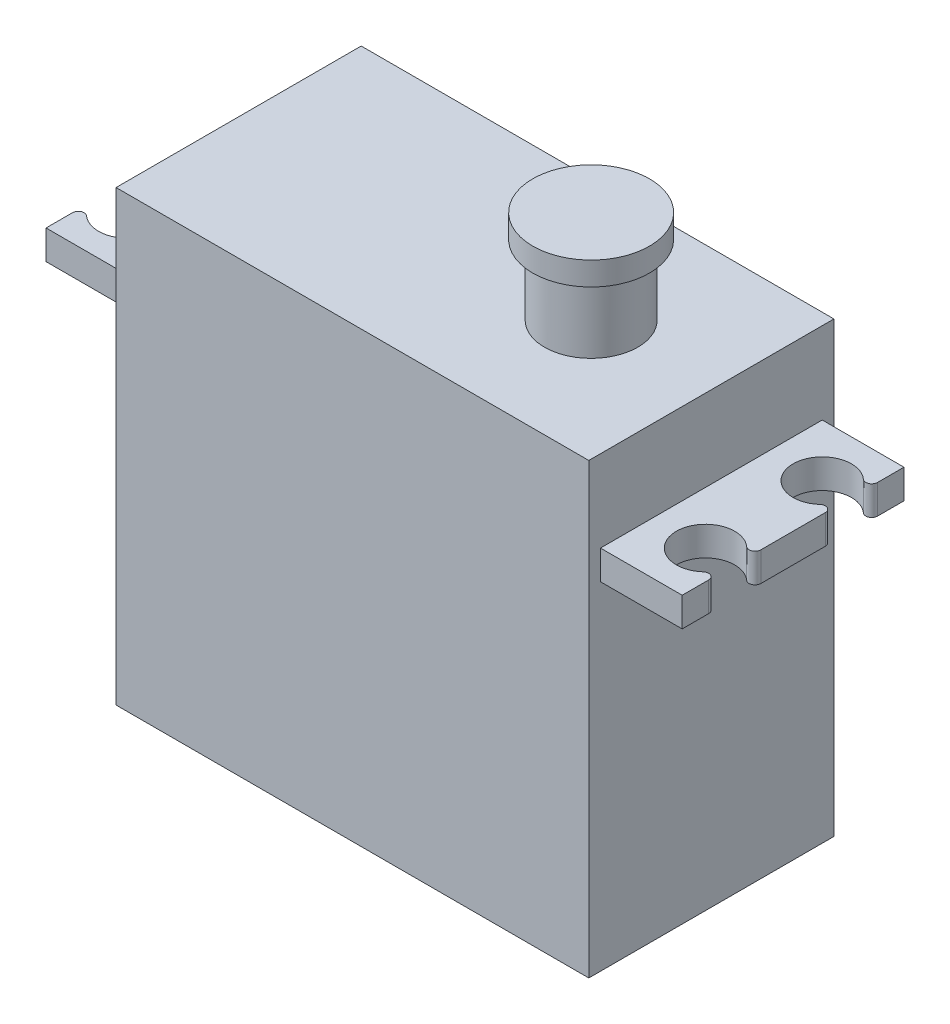
ISO-10303-21;
HEADER;
FILE_DESCRIPTION(('STEP AP214'),'2;1');
FILE_NAME('part.step','',(''),(''),'','','');
FILE_SCHEMA(('AUTOMOTIVE_DESIGN { 1 0 10303 214 1 1 1 1 }'));
ENDSEC;
DATA;
#1=APPLICATION_CONTEXT('core data for automotive mechanical design processes');
#2=APPLICATION_PROTOCOL_DEFINITION('international standard','automotive_design',2000,#1);
#3=PRODUCT_CONTEXT('',#1,'mechanical');
#4=PRODUCT('Part','Part','',(#3));
#5=PRODUCT_RELATED_PRODUCT_CATEGORY('part','',(#4));
#6=PRODUCT_DEFINITION_FORMATION('','',#4);
#7=PRODUCT_DEFINITION_CONTEXT('part definition',#1,'design');
#8=PRODUCT_DEFINITION('design','',#6,#7);
#9=PRODUCT_DEFINITION_SHAPE('','',#8);
#10=(LENGTH_UNIT() NAMED_UNIT(*) SI_UNIT(.MILLI.,.METRE.));
#11=(NAMED_UNIT(*) PLANE_ANGLE_UNIT() SI_UNIT($,.RADIAN.));
#12=(NAMED_UNIT(*) SI_UNIT($,.STERADIAN.) SOLID_ANGLE_UNIT());
#13=UNCERTAINTY_MEASURE_WITH_UNIT(LENGTH_MEASURE(1.E-05),#10,'distance_accuracy_value','');
#14=(GEOMETRIC_REPRESENTATION_CONTEXT(3) GLOBAL_UNCERTAINTY_ASSIGNED_CONTEXT((#13)) GLOBAL_UNIT_ASSIGNED_CONTEXT((#10,
#11,#12)) REPRESENTATION_CONTEXT('',''));
#15=CARTESIAN_POINT('',(0.,0.,0.));
#16=DIRECTION('',(0.,0.,1.));
#17=DIRECTION('',(1.,0.,0.));
#18=AXIS2_PLACEMENT_3D('',#15,#16,#17);
#19=CARTESIAN_POINT('',(9.94999999999999,46.4,0.));
#20=DIRECTION('',(0.,-1.,0.));
#21=DIRECTION('',(0.,0.,-1.));
#22=AXIS2_PLACEMENT_3D('',#19,#20,#21);
#23=CYLINDRICAL_SURFACE('',#22,5.);
#24=CARTESIAN_POINT('',(9.94999999999999,46.4,0.));
#25=DIRECTION('',(0.,1.,0.));
#26=DIRECTION('',(0.,0.,1.));
#27=AXIS2_PLACEMENT_3D('',#24,#25,#26);
#28=CIRCLE('',#27,5.);
#29=CARTESIAN_POINT('',(9.94999999999999,46.4,5.));
#30=VERTEX_POINT('',#29);
#31=EDGE_CURVE('E11',#30,#30,#28,.T.);
#32=ORIENTED_EDGE('',*,*,#31,.F.);
#33=EDGE_LOOP('',(#32));
#34=FACE_BOUND('',#33,.T.);
#35=CARTESIAN_POINT('',(9.94999999999999,44.4,0.));
#36=DIRECTION('',(0.,1.,0.));
#37=DIRECTION('',(0.,0.,1.));
#38=AXIS2_PLACEMENT_3D('',#35,#36,#37);
#39=CIRCLE('',#38,5.);
#40=CARTESIAN_POINT('',(9.94999999999999,44.4,5.));
#41=VERTEX_POINT('',#40);
#42=EDGE_CURVE('E47',#41,#41,#39,.T.);
#43=ORIENTED_EDGE('',*,*,#42,.T.);
#44=EDGE_LOOP('',(#43));
#45=FACE_BOUND('',#44,.T.);
#46=ADVANCED_FACE('F44',(#34,#45),#23,.T.);
#47=CARTESIAN_POINT('',(0.,46.4,0.));
#48=DIRECTION('',(0.,1.,0.));
#49=DIRECTION('',(0.,0.,1.));
#50=AXIS2_PLACEMENT_3D('',#47,#48,#49);
#51=PLANE('',#50);
#52=ORIENTED_EDGE('',*,*,#31,.T.);
#53=EDGE_LOOP('',(#52));
#54=FACE_BOUND('',#53,.T.);
#55=ADVANCED_FACE('F59',(#54),#51,.T.);
#56=CARTESIAN_POINT('',(0.,44.4,0.));
#57=DIRECTION('',(0.,1.,0.));
#58=DIRECTION('',(0.,0.,1.));
#59=AXIS2_PLACEMENT_3D('',#56,#57,#58);
#60=PLANE('',#59);
#61=ORIENTED_EDGE('',*,*,#42,.F.);
#62=EDGE_LOOP('',(#61));
#63=FACE_BOUND('',#62,.T.);
#64=ADVANCED_FACE('F57',(#63),#60,.F.);
#65=CLOSED_SHELL('',(#46,#55,#64));
#66=MANIFOLD_SOLID_BREP('B2',#65);
#67=CARTESIAN_POINT('',(20.25,38.4,10.5));
#68=DIRECTION('',(-1.,0.,0.));
#69=DIRECTION('',(0.,0.,1.));
#70=AXIS2_PLACEMENT_3D('',#67,#68,#69);
#71=PLANE('',#70);
#72=DIRECTION('',(0.,0.,-1.));
#73=VECTOR('',#72,1.);
#74=CARTESIAN_POINT('',(20.25,0.,10.5));
#75=LINE('',#74,#73);
#76=CARTESIAN_POINT('',(20.25,0.,10.5));
#77=VERTEX_POINT('',#76);
#78=CARTESIAN_POINT('',(20.25,0.,-10.5));
#79=VERTEX_POINT('',#78);
#80=EDGE_CURVE('E455',#77,#79,#75,.T.);
#81=ORIENTED_EDGE('',*,*,#80,.T.);
#82=DIRECTION('',(0.,-1.,0.));
#83=VECTOR('',#82,1.);
#84=CARTESIAN_POINT('',(20.25,38.4,-10.5));
#85=LINE('',#84,#83);
#86=CARTESIAN_POINT('',(20.25,38.4,-10.5));
#87=VERTEX_POINT('',#86);
#88=EDGE_CURVE('E482',#87,#79,#85,.T.);
#89=ORIENTED_EDGE('',*,*,#88,.F.);
#90=DIRECTION('',(0.,0.,-1.));
#91=VECTOR('',#90,1.);
#92=CARTESIAN_POINT('',(20.25,38.4,10.5));
#93=LINE('',#92,#91);
#94=CARTESIAN_POINT('',(20.25,38.4,10.5));
#95=VERTEX_POINT('',#94);
#96=EDGE_CURVE('E456',#95,#87,#93,.T.);
#97=ORIENTED_EDGE('',*,*,#96,.F.);
#98=DIRECTION('',(0.,-1.,0.));
#99=VECTOR('',#98,1.);
#100=CARTESIAN_POINT('',(20.25,38.4,10.5));
#101=LINE('',#100,#99);
#102=EDGE_CURVE('E466',#95,#77,#101,.T.);
#103=ORIENTED_EDGE('',*,*,#102,.T.);
#104=EDGE_LOOP('',(#81,#89,#97,#103));
#105=FACE_BOUND('',#104,.T.);
#106=DIRECTION('',(0.,0.,1.));
#107=VECTOR('',#106,1.);
#108=CARTESIAN_POINT('',(20.25,31.4,10.5));
#109=LINE('',#108,#107);
#110=CARTESIAN_POINT('',(20.25,31.4,-9.49999999999999));
#111=VERTEX_POINT('',#110);
#112=CARTESIAN_POINT('',(20.25,31.4,9.50000000000001));
#113=VERTEX_POINT('',#112);
#114=EDGE_CURVE('E446',#111,#113,#109,.T.);
#115=ORIENTED_EDGE('',*,*,#114,.F.);
#116=DIRECTION('',(0.,-1.,0.));
#117=VECTOR('',#116,1.);
#118=CARTESIAN_POINT('',(20.25,38.4,-9.49999999999999));
#119=LINE('',#118,#117);
#120=CARTESIAN_POINT('',(20.25,28.9,-9.49999999999999));
#121=VERTEX_POINT('',#120);
#122=EDGE_CURVE('E276',#111,#121,#119,.T.);
#123=ORIENTED_EDGE('',*,*,#122,.T.);
#124=DIRECTION('',(0.,0.,1.));
#125=VECTOR('',#124,1.);
#126=CARTESIAN_POINT('',(20.25,28.9,10.5));
#127=LINE('',#126,#125);
#128=CARTESIAN_POINT('',(20.25,28.9,9.50000000000001));
#129=VERTEX_POINT('',#128);
#130=EDGE_CURVE('E407',#121,#129,#127,.T.);
#131=ORIENTED_EDGE('',*,*,#130,.T.);
#132=DIRECTION('',(0.,1.,0.));
#133=VECTOR('',#132,1.);
#134=CARTESIAN_POINT('',(20.25,38.4,9.50000000000001));
#135=LINE('',#134,#133);
#136=EDGE_CURVE('E448',#129,#113,#135,.T.);
#137=ORIENTED_EDGE('',*,*,#136,.T.);
#138=EDGE_LOOP('',(#115,#123,#131,#137));
#139=FACE_BOUND('',#138,.T.);
#140=ADVANCED_FACE('F84',(#105,#139),#71,.F.);
#141=CARTESIAN_POINT('',(-20.25,38.4,10.5));
#142=DIRECTION('',(1.,0.,0.));
#143=DIRECTION('',(0.,0.,-1.));
#144=AXIS2_PLACEMENT_3D('',#141,#142,#143);
#145=PLANE('',#144);
#146=DIRECTION('',(0.,0.,1.));
#147=VECTOR('',#146,1.);
#148=CARTESIAN_POINT('',(-20.25,0.,10.5));
#149=LINE('',#148,#147);
#150=CARTESIAN_POINT('',(-20.25,0.,-10.5));
#151=VERTEX_POINT('',#150);
#152=CARTESIAN_POINT('',(-20.25,0.,10.5));
#153=VERTEX_POINT('',#152);
#154=EDGE_CURVE('E471',#151,#153,#149,.T.);
#155=ORIENTED_EDGE('',*,*,#154,.T.);
#156=DIRECTION('',(0.,-1.,0.));
#157=VECTOR('',#156,1.);
#158=CARTESIAN_POINT('',(-20.25,38.4,10.5));
#159=LINE('',#158,#157);
#160=CARTESIAN_POINT('',(-20.25,38.4,10.5));
#161=VERTEX_POINT('',#160);
#162=EDGE_CURVE('E476',#161,#153,#159,.T.);
#163=ORIENTED_EDGE('',*,*,#162,.F.);
#164=DIRECTION('',(0.,0.,1.));
#165=VECTOR('',#164,1.);
#166=CARTESIAN_POINT('',(-20.25,38.4,10.5));
#167=LINE('',#166,#165);
#168=CARTESIAN_POINT('',(-20.25,38.4,-10.5));
#169=VERTEX_POINT('',#168);
#170=EDGE_CURVE('E462',#169,#161,#167,.T.);
#171=ORIENTED_EDGE('',*,*,#170,.F.);
#172=DIRECTION('',(0.,-1.,0.));
#173=VECTOR('',#172,1.);
#174=CARTESIAN_POINT('',(-20.25,38.4,-10.5));
#175=LINE('',#174,#173);
#176=EDGE_CURVE('E479',#169,#151,#175,.T.);
#177=ORIENTED_EDGE('',*,*,#176,.T.);
#178=EDGE_LOOP('',(#155,#163,#171,#177));
#179=FACE_BOUND('',#178,.T.);
#180=DIRECTION('',(0.,0.,-1.));
#181=VECTOR('',#180,1.);
#182=CARTESIAN_POINT('',(-20.25,31.4,10.5));
#183=LINE('',#182,#181);
#184=CARTESIAN_POINT('',(-20.25,31.4,9.5));
#185=VERTEX_POINT('',#184);
#186=CARTESIAN_POINT('',(-20.25,31.4,-9.50000000000001));
#187=VERTEX_POINT('',#186);
#188=EDGE_CURVE('E42',#185,#187,#183,.T.);
#189=ORIENTED_EDGE('',*,*,#188,.F.);
#190=DIRECTION('',(0.,-1.,0.));
#191=VECTOR('',#190,1.);
#192=CARTESIAN_POINT('',(-20.25,38.4,9.5));
#193=LINE('',#192,#191);
#194=CARTESIAN_POINT('',(-20.25,28.9,9.5));
#195=VERTEX_POINT('',#194);
#196=EDGE_CURVE('E491',#185,#195,#193,.T.);
#197=ORIENTED_EDGE('',*,*,#196,.T.);
#198=DIRECTION('',(0.,0.,-1.));
#199=VECTOR('',#198,1.);
#200=CARTESIAN_POINT('',(-20.25,28.9,10.5));
#201=LINE('',#200,#199);
#202=CARTESIAN_POINT('',(-20.25,28.9,-9.50000000000001));
#203=VERTEX_POINT('',#202);
#204=EDGE_CURVE('E488',#195,#203,#201,.T.);
#205=ORIENTED_EDGE('',*,*,#204,.T.);
#206=DIRECTION('',(0.,1.,0.));
#207=VECTOR('',#206,1.);
#208=CARTESIAN_POINT('',(-20.25,38.4,-9.50000000000001));
#209=LINE('',#208,#207);
#210=EDGE_CURVE('E91',#203,#187,#209,.T.);
#211=ORIENTED_EDGE('',*,*,#210,.T.);
#212=EDGE_LOOP('',(#189,#197,#205,#211));
#213=FACE_BOUND('',#212,.T.);
#214=ADVANCED_FACE('F496',(#179,#213),#145,.F.);
#215=CARTESIAN_POINT('',(-20.25,38.4,-10.5));
#216=DIRECTION('',(0.,0.,1.));
#217=DIRECTION('',(1.,0.,0.));
#218=AXIS2_PLACEMENT_3D('',#215,#216,#217);
#219=PLANE('',#218);
#220=DIRECTION('',(-1.,0.,0.));
#221=VECTOR('',#220,1.);
#222=CARTESIAN_POINT('',(-20.25,0.,-10.5));
#223=LINE('',#222,#221);
#224=EDGE_CURVE('E469',#79,#151,#223,.T.);
#225=ORIENTED_EDGE('',*,*,#224,.T.);
#226=ORIENTED_EDGE('',*,*,#176,.F.);
#227=DIRECTION('',(-1.,0.,0.));
#228=VECTOR('',#227,1.);
#229=CARTESIAN_POINT('',(-20.25,38.4,-10.5));
#230=LINE('',#229,#228);
#231=EDGE_CURVE('E459',#87,#169,#230,.T.);
#232=ORIENTED_EDGE('',*,*,#231,.F.);
#233=ORIENTED_EDGE('',*,*,#88,.T.);
#234=EDGE_LOOP('',(#225,#226,#232,#233));
#235=FACE_BOUND('',#234,.T.);
#236=ADVANCED_FACE('F561',(#235),#219,.F.);
#237=CARTESIAN_POINT('',(-20.25,38.4,10.5));
#238=DIRECTION('',(0.,0.,-1.));
#239=DIRECTION('',(-1.,0.,0.));
#240=AXIS2_PLACEMENT_3D('',#237,#238,#239);
#241=PLANE('',#240);
#242=DIRECTION('',(1.,0.,0.));
#243=VECTOR('',#242,1.);
#244=CARTESIAN_POINT('',(-20.25,0.,10.5));
#245=LINE('',#244,#243);
#246=EDGE_CURVE('E460',#153,#77,#245,.T.);
#247=ORIENTED_EDGE('',*,*,#246,.T.);
#248=ORIENTED_EDGE('',*,*,#102,.F.);
#249=DIRECTION('',(1.,0.,0.));
#250=VECTOR('',#249,1.);
#251=CARTESIAN_POINT('',(-20.25,38.4,10.5));
#252=LINE('',#251,#250);
#253=EDGE_CURVE('E464',#161,#95,#252,.T.);
#254=ORIENTED_EDGE('',*,*,#253,.F.);
#255=ORIENTED_EDGE('',*,*,#162,.T.);
#256=EDGE_LOOP('',(#247,#248,#254,#255));
#257=FACE_BOUND('',#256,.T.);
#258=ADVANCED_FACE('F623',(#257),#241,.F.);
#259=CARTESIAN_POINT('',(0.,38.4,0.));
#260=DIRECTION('',(0.,-1.,0.));
#261=DIRECTION('',(0.,0.,-1.));
#262=AXIS2_PLACEMENT_3D('',#259,#260,#261);
#263=PLANE('',#262);
#264=CARTESIAN_POINT('',(9.94999999999999,38.4,0.));
#265=DIRECTION('',(0.,-1.,0.));
#266=DIRECTION('',(0.,0.,-1.));
#267=AXIS2_PLACEMENT_3D('',#264,#265,#266);
#268=CIRCLE('',#267,4.);
#269=CARTESIAN_POINT('',(9.94999999999999,38.4,-4.));
#270=VERTEX_POINT('',#269);
#271=EDGE_CURVE('E485',#270,#270,#268,.F.);
#272=ORIENTED_EDGE('',*,*,#271,.F.);
#273=EDGE_LOOP('',(#272));
#274=FACE_BOUND('',#273,.T.);
#275=ORIENTED_EDGE('',*,*,#96,.T.);
#276=ORIENTED_EDGE('',*,*,#231,.T.);
#277=ORIENTED_EDGE('',*,*,#170,.T.);
#278=ORIENTED_EDGE('',*,*,#253,.T.);
#279=EDGE_LOOP('',(#275,#276,#277,#278));
#280=FACE_BOUND('',#279,.T.);
#281=ADVANCED_FACE('F620',(#274,#280),#263,.F.);
#282=CARTESIAN_POINT('',(0.,0.,0.));
#283=DIRECTION('',(0.,-1.,0.));
#284=DIRECTION('',(0.,0.,-1.));
#285=AXIS2_PLACEMENT_3D('',#282,#283,#284);
#286=PLANE('',#285);
#287=ORIENTED_EDGE('',*,*,#80,.F.);
#288=ORIENTED_EDGE('',*,*,#246,.F.);
#289=ORIENTED_EDGE('',*,*,#154,.F.);
#290=ORIENTED_EDGE('',*,*,#224,.F.);
#291=EDGE_LOOP('',(#287,#288,#289,#290));
#292=FACE_BOUND('',#291,.T.);
#293=ADVANCED_FACE('F618',(#292),#286,.T.);
#294=CARTESIAN_POINT('',(9.94999999999999,44.4,0.));
#295=DIRECTION('',(0.,-1.,0.));
#296=DIRECTION('',(0.,0.,-1.));
#297=AXIS2_PLACEMENT_3D('',#294,#295,#296);
#298=CYLINDRICAL_SURFACE('',#297,4.);
#299=CARTESIAN_POINT('',(9.94999999999999,44.4,0.));
#300=DIRECTION('',(0.,1.,0.));
#301=DIRECTION('',(0.,0.,1.));
#302=AXIS2_PLACEMENT_3D('',#299,#300,#301);
#303=CIRCLE('',#302,4.);
#304=CARTESIAN_POINT('',(9.94999999999999,44.4,4.));
#305=VERTEX_POINT('',#304);
#306=EDGE_CURVE('E452',#305,#305,#303,.T.);
#307=ORIENTED_EDGE('',*,*,#306,.F.);
#308=EDGE_LOOP('',(#307));
#309=FACE_BOUND('',#308,.T.);
#310=ORIENTED_EDGE('',*,*,#271,.T.);
#311=EDGE_LOOP('',(#310));
#312=FACE_BOUND('',#311,.T.);
#313=ADVANCED_FACE('F614',(#309,#312),#298,.T.);
#314=CARTESIAN_POINT('',(9.94999999999999,44.4,0.));
#315=DIRECTION('',(0.,1.,0.));
#316=DIRECTION('',(0.,0.,1.));
#317=AXIS2_PLACEMENT_3D('',#314,#315,#316);
#318=PLANE('',#317);
#319=ORIENTED_EDGE('',*,*,#306,.T.);
#320=EDGE_LOOP('',(#319));
#321=FACE_BOUND('',#320,.T.);
#322=ADVANCED_FACE('F611',(#321),#318,.T.);
#323=CARTESIAN_POINT('',(-27.25,31.4,-7.23606797749977));
#324=DIRECTION('',(-1.,0.,0.));
#325=DIRECTION('',(0.,0.,1.));
#326=AXIS2_PLACEMENT_3D('',#323,#324,#325);
#327=PLANE('',#326);
#328=DIRECTION('',(0.,0.,-1.));
#329=VECTOR('',#328,1.);
#330=CARTESIAN_POINT('',(-27.25,28.9,-7.23606797749977));
#331=LINE('',#330,#329);
#332=CARTESIAN_POINT('',(-27.25,28.9,-7.23606797749977));
#333=VERTEX_POINT('',#332);
#334=CARTESIAN_POINT('',(-27.25,28.9,-9.50000000000001));
#335=VERTEX_POINT('',#334);
#336=EDGE_CURVE('E281',#333,#335,#331,.T.);
#337=ORIENTED_EDGE('',*,*,#336,.F.);
#338=DIRECTION('',(0.,-1.,0.));
#339=VECTOR('',#338,1.);
#340=CARTESIAN_POINT('',(-27.25,31.4,-7.23606797749977));
#341=LINE('',#340,#339);
#342=CARTESIAN_POINT('',(-27.25,31.4,-7.23606797749977));
#343=VERTEX_POINT('',#342);
#344=EDGE_CURVE('E408',#343,#333,#341,.T.);
#345=ORIENTED_EDGE('',*,*,#344,.F.);
#346=DIRECTION('',(0.,0.,-1.));
#347=VECTOR('',#346,1.);
#348=CARTESIAN_POINT('',(-27.25,31.4,-7.23606797749977));
#349=LINE('',#348,#347);
#350=CARTESIAN_POINT('',(-27.25,31.4,-9.50000000000001));
#351=VERTEX_POINT('',#350);
#352=EDGE_CURVE('E290',#343,#351,#349,.T.);
#353=ORIENTED_EDGE('',*,*,#352,.T.);
#354=DIRECTION('',(0.,-1.,0.));
#355=VECTOR('',#354,1.);
#356=CARTESIAN_POINT('',(-27.25,31.4,-9.50000000000001));
#357=LINE('',#356,#355);
#358=EDGE_CURVE('E405',#351,#335,#357,.T.);
#359=ORIENTED_EDGE('',*,*,#358,.T.);
#360=EDGE_LOOP('',(#337,#345,#353,#359));
#361=FACE_BOUND('',#360,.T.);
#362=ADVANCED_FACE('F507',(#361),#327,.T.);
#363=CARTESIAN_POINT('',(-26.75,31.4,-7.23606797749977));
#364=DIRECTION('',(0.,-1.,0.));
#365=DIRECTION('',(0.,0.,-1.));
#366=AXIS2_PLACEMENT_3D('',#363,#364,#365);
#367=CYLINDRICAL_SURFACE('',#366,0.500000000000003);
#368=CARTESIAN_POINT('',(-26.75,28.9,-7.23606797749977));
#369=DIRECTION('',(0.,-1.,0.));
#370=DIRECTION('',(0.,0.,-1.));
#371=AXIS2_PLACEMENT_3D('',#368,#369,#370);
#372=CIRCLE('',#371,0.500000000000003);
#373=CARTESIAN_POINT('',(-26.4166666666667,28.9,-6.8633899812498));
#374=VERTEX_POINT('',#373);
#375=EDGE_CURVE('E401',#374,#333,#372,.T.);
#376=ORIENTED_EDGE('',*,*,#375,.F.);
#377=DIRECTION('',(0.,-1.,0.));
#378=VECTOR('',#377,1.);
#379=CARTESIAN_POINT('',(-26.4166666666667,31.4,-6.8633899812498));
#380=LINE('',#379,#378);
#381=CARTESIAN_POINT('',(-26.4166666666667,31.4,-6.8633899812498));
#382=VERTEX_POINT('',#381);
#383=EDGE_CURVE('E410',#382,#374,#380,.T.);
#384=ORIENTED_EDGE('',*,*,#383,.F.);
#385=CARTESIAN_POINT('',(-26.75,31.4,-7.23606797749977));
#386=DIRECTION('',(0.,-1.,0.));
#387=DIRECTION('',(0.,0.,-1.));
#388=AXIS2_PLACEMENT_3D('',#385,#386,#387);
#389=CIRCLE('',#388,0.500000000000003);
#390=EDGE_CURVE('E347',#382,#343,#389,.T.);
#391=ORIENTED_EDGE('',*,*,#390,.T.);
#392=ORIENTED_EDGE('',*,*,#344,.T.);
#393=EDGE_LOOP('',(#376,#384,#391,#392));
#394=FACE_BOUND('',#393,.T.);
#395=ADVANCED_FACE('F510',(#394),#367,.T.);
#396=CARTESIAN_POINT('',(-24.75,31.4,-4.99999999999999));
#397=DIRECTION('',(0.,-1.,0.));
#398=DIRECTION('',(0.,0.,-1.));
#399=AXIS2_PLACEMENT_3D('',#396,#397,#398);
#400=CYLINDRICAL_SURFACE('',#399,2.49999999999999);
#401=CARTESIAN_POINT('',(-24.75,28.9,-4.99999999999999));
#402=DIRECTION('',(0.,1.,0.));
#403=DIRECTION('',(0.,0.,-1.));
#404=AXIS2_PLACEMENT_3D('',#401,#402,#403);
#405=CIRCLE('',#404,2.49999999999999);
#406=CARTESIAN_POINT('',(-26.4166666666667,28.9,-3.13661001875018));
#407=VERTEX_POINT('',#406);
#408=EDGE_CURVE('E398',#407,#374,#405,.T.);
#409=ORIENTED_EDGE('',*,*,#408,.F.);
#410=DIRECTION('',(0.,-1.,0.));
#411=VECTOR('',#410,1.);
#412=CARTESIAN_POINT('',(-26.4166666666667,31.4,-3.13661001875018));
#413=LINE('',#412,#411);
#414=CARTESIAN_POINT('',(-26.4166666666667,31.4,-3.13661001875018));
#415=VERTEX_POINT('',#414);
#416=EDGE_CURVE('E412',#415,#407,#413,.T.);
#417=ORIENTED_EDGE('',*,*,#416,.F.);
#418=CARTESIAN_POINT('',(-24.75,31.4,-4.99999999999999));
#419=DIRECTION('',(0.,1.,0.));
#420=DIRECTION('',(0.,0.,-1.));
#421=AXIS2_PLACEMENT_3D('',#418,#419,#420);
#422=CIRCLE('',#421,2.49999999999999);
#423=EDGE_CURVE('E344',#415,#382,#422,.T.);
#424=ORIENTED_EDGE('',*,*,#423,.T.);
#425=ORIENTED_EDGE('',*,*,#383,.T.);
#426=EDGE_LOOP('',(#409,#417,#424,#425));
#427=FACE_BOUND('',#426,.T.);
#428=ADVANCED_FACE('F515',(#427),#400,.F.);
#429=CARTESIAN_POINT('',(-26.75,31.4,-2.76393202250022));
#430=DIRECTION('',(0.,-1.,0.));
#431=DIRECTION('',(0.,0.,-1.));
#432=AXIS2_PLACEMENT_3D('',#429,#430,#431);
#433=CYLINDRICAL_SURFACE('',#432,0.499999999999999);
#434=CARTESIAN_POINT('',(-26.75,28.9,-2.76393202250022));
#435=DIRECTION('',(0.,-1.,0.));
#436=DIRECTION('',(0.,0.,-1.));
#437=AXIS2_PLACEMENT_3D('',#434,#435,#436);
#438=CIRCLE('',#437,0.499999999999999);
#439=CARTESIAN_POINT('',(-27.25,28.9,-2.76393202250022));
#440=VERTEX_POINT('',#439);
#441=EDGE_CURVE('E395',#440,#407,#438,.T.);
#442=ORIENTED_EDGE('',*,*,#441,.F.);
#443=DIRECTION('',(0.,-1.,0.));
#444=VECTOR('',#443,1.);
#445=CARTESIAN_POINT('',(-27.25,31.4,-2.76393202250022));
#446=LINE('',#445,#444);
#447=CARTESIAN_POINT('',(-27.25,31.4,-2.76393202250022));
#448=VERTEX_POINT('',#447);
#449=EDGE_CURVE('E414',#448,#440,#446,.T.);
#450=ORIENTED_EDGE('',*,*,#449,.F.);
#451=CARTESIAN_POINT('',(-26.75,31.4,-2.76393202250022));
#452=DIRECTION('',(0.,-1.,0.));
#453=DIRECTION('',(0.,0.,-1.));
#454=AXIS2_PLACEMENT_3D('',#451,#452,#453);
#455=CIRCLE('',#454,0.499999999999999);
#456=EDGE_CURVE('E341',#448,#415,#455,.T.);
#457=ORIENTED_EDGE('',*,*,#456,.T.);
#458=ORIENTED_EDGE('',*,*,#416,.T.);
#459=EDGE_LOOP('',(#442,#450,#457,#458));
#460=FACE_BOUND('',#459,.T.);
#461=ADVANCED_FACE('F518',(#460),#433,.T.);
#462=CARTESIAN_POINT('',(-27.25,31.4,2.76393202250023));
#463=DIRECTION('',(-1.,0.,0.));
#464=DIRECTION('',(0.,0.,1.));
#465=AXIS2_PLACEMENT_3D('',#462,#463,#464);
#466=PLANE('',#465);
#467=DIRECTION('',(0.,0.,-1.));
#468=VECTOR('',#467,1.);
#469=CARTESIAN_POINT('',(-27.25,28.9,2.76393202250023));
#470=LINE('',#469,#468);
#471=CARTESIAN_POINT('',(-27.25,28.9,2.76393202250023));
#472=VERTEX_POINT('',#471);
#473=EDGE_CURVE('E392',#472,#440,#470,.T.);
#474=ORIENTED_EDGE('',*,*,#473,.F.);
#475=DIRECTION('',(0.,-1.,0.));
#476=VECTOR('',#475,1.);
#477=CARTESIAN_POINT('',(-27.25,31.4,2.76393202250023));
#478=LINE('',#477,#476);
#479=CARTESIAN_POINT('',(-27.25,31.4,2.76393202250023));
#480=VERTEX_POINT('',#479);
#481=EDGE_CURVE('E416',#480,#472,#478,.T.);
#482=ORIENTED_EDGE('',*,*,#481,.F.);
#483=DIRECTION('',(0.,0.,-1.));
#484=VECTOR('',#483,1.);
#485=CARTESIAN_POINT('',(-27.25,31.4,2.76393202250023));
#486=LINE('',#485,#484);
#487=EDGE_CURVE('E338',#480,#448,#486,.T.);
#488=ORIENTED_EDGE('',*,*,#487,.T.);
#489=ORIENTED_EDGE('',*,*,#449,.T.);
#490=EDGE_LOOP('',(#474,#482,#488,#489));
#491=FACE_BOUND('',#490,.T.);
#492=ADVANCED_FACE('F523',(#491),#466,.T.);
#493=CARTESIAN_POINT('',(-26.75,31.4,2.76393202250023));
#494=DIRECTION('',(0.,-1.,0.));
#495=DIRECTION('',(0.,0.,-1.));
#496=AXIS2_PLACEMENT_3D('',#493,#494,#495);
#497=CYLINDRICAL_SURFACE('',#496,0.499999999999999);
#498=CARTESIAN_POINT('',(-26.75,28.9,2.76393202250023));
#499=DIRECTION('',(0.,-1.,0.));
#500=DIRECTION('',(0.,0.,1.));
#501=AXIS2_PLACEMENT_3D('',#498,#499,#500);
#502=CIRCLE('',#501,0.499999999999999);
#503=CARTESIAN_POINT('',(-26.4166666666667,28.9,3.13661001875019));
#504=VERTEX_POINT('',#503);
#505=EDGE_CURVE('E389',#504,#472,#502,.T.);
#506=ORIENTED_EDGE('',*,*,#505,.F.);
#507=DIRECTION('',(0.,-1.,0.));
#508=VECTOR('',#507,1.);
#509=CARTESIAN_POINT('',(-26.4166666666667,31.4,3.13661001875019));
#510=LINE('',#509,#508);
#511=CARTESIAN_POINT('',(-26.4166666666667,31.4,3.13661001875019));
#512=VERTEX_POINT('',#511);
#513=EDGE_CURVE('E418',#512,#504,#510,.T.);
#514=ORIENTED_EDGE('',*,*,#513,.F.);
#515=CARTESIAN_POINT('',(-26.75,31.4,2.76393202250023));
#516=DIRECTION('',(0.,-1.,0.));
#517=DIRECTION('',(0.,0.,1.));
#518=AXIS2_PLACEMENT_3D('',#515,#516,#517);
#519=CIRCLE('',#518,0.499999999999999);
#520=EDGE_CURVE('E335',#512,#480,#519,.T.);
#521=ORIENTED_EDGE('',*,*,#520,.T.);
#522=ORIENTED_EDGE('',*,*,#481,.T.);
#523=EDGE_LOOP('',(#506,#514,#521,#522));
#524=FACE_BOUND('',#523,.T.);
#525=ADVANCED_FACE('F526',(#524),#497,.T.);
#526=CARTESIAN_POINT('',(-24.75,31.4,5.));
#527=DIRECTION('',(0.,-1.,0.));
#528=DIRECTION('',(0.,0.,-1.));
#529=AXIS2_PLACEMENT_3D('',#526,#527,#528);
#530=CYLINDRICAL_SURFACE('',#529,2.5);
#531=CARTESIAN_POINT('',(-24.75,28.9,5.));
#532=DIRECTION('',(0.,1.,0.));
#533=DIRECTION('',(0.,0.,1.));
#534=AXIS2_PLACEMENT_3D('',#531,#532,#533);
#535=CIRCLE('',#534,2.5);
#536=CARTESIAN_POINT('',(-26.4166666666667,28.9,6.86338998124982));
#537=VERTEX_POINT('',#536);
#538=EDGE_CURVE('E386',#537,#504,#535,.T.);
#539=ORIENTED_EDGE('',*,*,#538,.F.);
#540=DIRECTION('',(0.,-1.,0.));
#541=VECTOR('',#540,1.);
#542=CARTESIAN_POINT('',(-26.4166666666667,31.4,6.86338998124982));
#543=LINE('',#542,#541);
#544=CARTESIAN_POINT('',(-26.4166666666667,31.4,6.86338998124982));
#545=VERTEX_POINT('',#544);
#546=EDGE_CURVE('E420',#545,#537,#543,.T.);
#547=ORIENTED_EDGE('',*,*,#546,.F.);
#548=CARTESIAN_POINT('',(-24.75,31.4,5.));
#549=DIRECTION('',(0.,1.,0.));
#550=DIRECTION('',(0.,0.,1.));
#551=AXIS2_PLACEMENT_3D('',#548,#549,#550);
#552=CIRCLE('',#551,2.5);
#553=EDGE_CURVE('E332',#545,#512,#552,.T.);
#554=ORIENTED_EDGE('',*,*,#553,.T.);
#555=ORIENTED_EDGE('',*,*,#513,.T.);
#556=EDGE_LOOP('',(#539,#547,#554,#555));
#557=FACE_BOUND('',#556,.T.);
#558=ADVANCED_FACE('F531',(#557),#530,.F.);
#559=CARTESIAN_POINT('',(-26.75,31.4,7.23606797749978));
#560=DIRECTION('',(0.,-1.,0.));
#561=DIRECTION('',(0.,0.,-1.));
#562=AXIS2_PLACEMENT_3D('',#559,#560,#561);
#563=CYLINDRICAL_SURFACE('',#562,0.500000000000002);
#564=CARTESIAN_POINT('',(-26.75,28.9,7.23606797749978));
#565=DIRECTION('',(0.,-1.,0.));
#566=DIRECTION('',(0.,0.,1.));
#567=AXIS2_PLACEMENT_3D('',#564,#565,#566);
#568=CIRCLE('',#567,0.500000000000002);
#569=CARTESIAN_POINT('',(-27.25,28.9,7.23606797749978));
#570=VERTEX_POINT('',#569);
#571=EDGE_CURVE('E383',#570,#537,#568,.T.);
#572=ORIENTED_EDGE('',*,*,#571,.F.);
#573=DIRECTION('',(0.,-1.,0.));
#574=VECTOR('',#573,1.);
#575=CARTESIAN_POINT('',(-27.25,31.4,7.23606797749978));
#576=LINE('',#575,#574);
#577=CARTESIAN_POINT('',(-27.25,31.4,7.23606797749978));
#578=VERTEX_POINT('',#577);
#579=EDGE_CURVE('E422',#578,#570,#576,.T.);
#580=ORIENTED_EDGE('',*,*,#579,.F.);
#581=CARTESIAN_POINT('',(-26.75,31.4,7.23606797749978));
#582=DIRECTION('',(0.,-1.,0.));
#583=DIRECTION('',(0.,0.,1.));
#584=AXIS2_PLACEMENT_3D('',#581,#582,#583);
#585=CIRCLE('',#584,0.500000000000002);
#586=EDGE_CURVE('E329',#578,#545,#585,.T.);
#587=ORIENTED_EDGE('',*,*,#586,.T.);
#588=ORIENTED_EDGE('',*,*,#546,.T.);
#589=EDGE_LOOP('',(#572,#580,#587,#588));
#590=FACE_BOUND('',#589,.T.);
#591=ADVANCED_FACE('F534',(#590),#563,.T.);
#592=CARTESIAN_POINT('',(-27.25,31.4,9.49999999999999));
#593=DIRECTION('',(-1.,0.,0.));
#594=DIRECTION('',(0.,0.,1.));
#595=AXIS2_PLACEMENT_3D('',#592,#593,#594);
#596=PLANE('',#595);
#597=DIRECTION('',(0.,0.,-1.));
#598=VECTOR('',#597,1.);
#599=CARTESIAN_POINT('',(-27.25,28.9,9.49999999999999));
#600=LINE('',#599,#598);
#601=CARTESIAN_POINT('',(-27.25,28.9,9.49999999999999));
#602=VERTEX_POINT('',#601);
#603=EDGE_CURVE('E380',#602,#570,#600,.T.);
#604=ORIENTED_EDGE('',*,*,#603,.F.);
#605=DIRECTION('',(0.,-1.,0.));
#606=VECTOR('',#605,1.);
#607=CARTESIAN_POINT('',(-27.25,31.4,9.49999999999999));
#608=LINE('',#607,#606);
#609=CARTESIAN_POINT('',(-27.25,31.4,9.49999999999999));
#610=VERTEX_POINT('',#609);
#611=EDGE_CURVE('E424',#610,#602,#608,.T.);
#612=ORIENTED_EDGE('',*,*,#611,.F.);
#613=DIRECTION('',(0.,0.,-1.));
#614=VECTOR('',#613,1.);
#615=CARTESIAN_POINT('',(-27.25,31.4,9.49999999999999));
#616=LINE('',#615,#614);
#617=EDGE_CURVE('E326',#610,#578,#616,.T.);
#618=ORIENTED_EDGE('',*,*,#617,.T.);
#619=ORIENTED_EDGE('',*,*,#579,.T.);
#620=EDGE_LOOP('',(#604,#612,#618,#619));
#621=FACE_BOUND('',#620,.T.);
#622=ADVANCED_FACE('F539',(#621),#596,.T.);
#623=CARTESIAN_POINT('',(-26.75,28.9,-7.23606797749977));
#624=DIRECTION('',(0.,-1.,0.));
#625=DIRECTION('',(0.,0.,-1.));
#626=AXIS2_PLACEMENT_3D('',#623,#624,#625);
#627=PLANE('',#626);
#628=ORIENTED_EDGE('',*,*,#204,.F.);
#629=DIRECTION('',(-1.,0.,0.));
#630=VECTOR('',#629,1.);
#631=CARTESIAN_POINT('',(27.25,28.9,9.50000000000001));
#632=LINE('',#631,#630);
#633=EDGE_CURVE('E378',#195,#602,#632,.T.);
#634=ORIENTED_EDGE('',*,*,#633,.T.);
#635=ORIENTED_EDGE('',*,*,#603,.T.);
#636=ORIENTED_EDGE('',*,*,#571,.T.);
#637=ORIENTED_EDGE('',*,*,#538,.T.);
#638=ORIENTED_EDGE('',*,*,#505,.T.);
#639=ORIENTED_EDGE('',*,*,#473,.T.);
#640=ORIENTED_EDGE('',*,*,#441,.T.);
#641=ORIENTED_EDGE('',*,*,#408,.T.);
#642=ORIENTED_EDGE('',*,*,#375,.T.);
#643=ORIENTED_EDGE('',*,*,#336,.T.);
#644=DIRECTION('',(1.,0.,0.));
#645=VECTOR('',#644,1.);
#646=CARTESIAN_POINT('',(27.25,28.9,-9.49999999999999));
#647=LINE('',#646,#645);
#648=EDGE_CURVE('E106',#335,#203,#647,.T.);
#649=ORIENTED_EDGE('',*,*,#648,.T.);
#650=EDGE_LOOP('',(#628,#634,#635,#636,#637,#638,#639,#640,#641,#642,#643,#649));
#651=FACE_BOUND('',#650,.T.);
#652=ADVANCED_FACE('F543',(#651),#627,.T.);
#653=CARTESIAN_POINT('',(-26.75,31.4,-7.23606797749977));
#654=DIRECTION('',(0.,-1.,0.));
#655=DIRECTION('',(0.,0.,-1.));
#656=AXIS2_PLACEMENT_3D('',#653,#654,#655);
#657=PLANE('',#656);
#658=DIRECTION('',(-1.,0.,0.));
#659=VECTOR('',#658,1.);
#660=CARTESIAN_POINT('',(27.25,31.4,9.50000000000001));
#661=LINE('',#660,#659);
#662=EDGE_CURVE('E322',#185,#610,#661,.T.);
#663=ORIENTED_EDGE('',*,*,#662,.F.);
#664=ORIENTED_EDGE('',*,*,#188,.T.);
#665=DIRECTION('',(1.,0.,0.));
#666=VECTOR('',#665,1.);
#667=CARTESIAN_POINT('',(27.25,31.4,-9.49999999999999));
#668=LINE('',#667,#666);
#669=EDGE_CURVE('E280',#351,#187,#668,.T.);
#670=ORIENTED_EDGE('',*,*,#669,.F.);
#671=ORIENTED_EDGE('',*,*,#352,.F.);
#672=ORIENTED_EDGE('',*,*,#390,.F.);
#673=ORIENTED_EDGE('',*,*,#423,.F.);
#674=ORIENTED_EDGE('',*,*,#456,.F.);
#675=ORIENTED_EDGE('',*,*,#487,.F.);
#676=ORIENTED_EDGE('',*,*,#520,.F.);
#677=ORIENTED_EDGE('',*,*,#553,.F.);
#678=ORIENTED_EDGE('',*,*,#586,.F.);
#679=ORIENTED_EDGE('',*,*,#617,.F.);
#680=EDGE_LOOP('',(#663,#664,#670,#671,#672,#673,#674,#675,#676,#677,#678,#679));
#681=FACE_BOUND('',#680,.T.);
#682=ADVANCED_FACE('F503',(#681),#657,.F.);
#683=CARTESIAN_POINT('',(27.25,31.4,9.50000000000001));
#684=DIRECTION('',(0.,0.,1.));
#685=DIRECTION('',(1.,0.,0.));
#686=AXIS2_PLACEMENT_3D('',#683,#684,#685);
#687=PLANE('',#686);
#688=ORIENTED_EDGE('',*,*,#196,.F.);
#689=ORIENTED_EDGE('',*,*,#662,.T.);
#690=ORIENTED_EDGE('',*,*,#611,.T.);
#691=ORIENTED_EDGE('',*,*,#633,.F.);
#692=EDGE_LOOP('',(#688,#689,#690,#691));
#693=FACE_BOUND('',#692,.T.);
#694=ADVANCED_FACE('F542',(#693),#687,.T.);
#695=CARTESIAN_POINT('',(27.25,31.4,-9.49999999999999));
#696=DIRECTION('',(0.,0.,-1.));
#697=DIRECTION('',(-1.,0.,0.));
#698=AXIS2_PLACEMENT_3D('',#695,#696,#697);
#699=PLANE('',#698);
#700=ORIENTED_EDGE('',*,*,#210,.F.);
#701=ORIENTED_EDGE('',*,*,#648,.F.);
#702=ORIENTED_EDGE('',*,*,#358,.F.);
#703=ORIENTED_EDGE('',*,*,#669,.T.);
#704=EDGE_LOOP('',(#700,#701,#702,#703));
#705=FACE_BOUND('',#704,.T.);
#706=ADVANCED_FACE('F498',(#705),#699,.T.);
#707=ORIENTED_EDGE('',*,*,#122,.F.);
#708=CARTESIAN_POINT('',(27.25,31.4,-9.49999999999999));
#709=VERTEX_POINT('',#708);
#710=EDGE_CURVE('E269',#111,#709,#668,.T.);
#711=ORIENTED_EDGE('',*,*,#710,.T.);
#712=DIRECTION('',(0.,-1.,0.));
#713=VECTOR('',#712,1.);
#714=CARTESIAN_POINT('',(27.25,31.4,-9.49999999999999));
#715=LINE('',#714,#713);
#716=CARTESIAN_POINT('',(27.25,28.9,-9.49999999999999));
#717=VERTEX_POINT('',#716);
#718=EDGE_CURVE('E273',#709,#717,#715,.T.);
#719=ORIENTED_EDGE('',*,*,#718,.T.);
#720=EDGE_CURVE('E353',#121,#717,#647,.T.);
#721=ORIENTED_EDGE('',*,*,#720,.F.);
#722=EDGE_LOOP('',(#707,#711,#719,#721));
#723=FACE_BOUND('',#722,.T.);
#724=ADVANCED_FACE('F271',(#723),#699,.T.);
#725=ORIENTED_EDGE('',*,*,#136,.F.);
#726=CARTESIAN_POINT('',(27.25,28.9,9.50000000000001));
#727=VERTEX_POINT('',#726);
#728=EDGE_CURVE('E98',#727,#129,#632,.T.);
#729=ORIENTED_EDGE('',*,*,#728,.F.);
#730=DIRECTION('',(0.,-1.,0.));
#731=VECTOR('',#730,1.);
#732=CARTESIAN_POINT('',(27.25,31.4,9.50000000000001));
#733=LINE('',#732,#731);
#734=CARTESIAN_POINT('',(27.25,31.4,9.50000000000001));
#735=VERTEX_POINT('',#734);
#736=EDGE_CURVE('E427',#735,#727,#733,.T.);
#737=ORIENTED_EDGE('',*,*,#736,.F.);
#738=EDGE_CURVE('E323',#735,#113,#661,.T.);
#739=ORIENTED_EDGE('',*,*,#738,.T.);
#740=EDGE_LOOP('',(#725,#729,#737,#739));
#741=FACE_BOUND('',#740,.T.);
#742=ADVANCED_FACE('F570',(#741),#687,.T.);
#743=ORIENTED_EDGE('',*,*,#710,.F.);
#744=ORIENTED_EDGE('',*,*,#114,.T.);
#745=ORIENTED_EDGE('',*,*,#738,.F.);
#746=DIRECTION('',(0.,0.,1.));
#747=VECTOR('',#746,1.);
#748=CARTESIAN_POINT('',(27.25,31.4,9.50000000000001));
#749=LINE('',#748,#747);
#750=CARTESIAN_POINT('',(27.25,31.4,7.23606797749978));
#751=VERTEX_POINT('',#750);
#752=EDGE_CURVE('E319',#751,#735,#749,.T.);
#753=ORIENTED_EDGE('',*,*,#752,.F.);
#754=CARTESIAN_POINT('',(26.75,31.4,7.23606797749978));
#755=DIRECTION('',(0.,-1.,0.));
#756=DIRECTION('',(0.,0.,-1.));
#757=AXIS2_PLACEMENT_3D('',#754,#755,#756);
#758=CIRCLE('',#757,0.500000000000002);
#759=CARTESIAN_POINT('',(26.4166666666667,31.4,6.86338998124982));
#760=VERTEX_POINT('',#759);
#761=EDGE_CURVE('E316',#760,#751,#758,.T.);
#762=ORIENTED_EDGE('',*,*,#761,.F.);
#763=CARTESIAN_POINT('',(24.75,31.4,5.));
#764=DIRECTION('',(0.,1.,0.));
#765=DIRECTION('',(0.,0.,-1.));
#766=AXIS2_PLACEMENT_3D('',#763,#764,#765);
#767=CIRCLE('',#766,2.5);
#768=CARTESIAN_POINT('',(26.4166666666667,31.4,3.13661001875019));
#769=VERTEX_POINT('',#768);
#770=EDGE_CURVE('E313',#769,#760,#767,.T.);
#771=ORIENTED_EDGE('',*,*,#770,.F.);
#772=CARTESIAN_POINT('',(26.75,31.4,2.76393202250023));
#773=DIRECTION('',(0.,-1.,0.));
#774=DIRECTION('',(0.,0.,-1.));
#775=AXIS2_PLACEMENT_3D('',#772,#773,#774);
#776=CIRCLE('',#775,0.499999999999999);
#777=CARTESIAN_POINT('',(27.25,31.4,2.76393202250023));
#778=VERTEX_POINT('',#777);
#779=EDGE_CURVE('E310',#778,#769,#776,.T.);
#780=ORIENTED_EDGE('',*,*,#779,.F.);
#781=DIRECTION('',(0.,0.,1.));
#782=VECTOR('',#781,1.);
#783=CARTESIAN_POINT('',(27.25,31.4,2.76393202250023));
#784=LINE('',#783,#782);
#785=CARTESIAN_POINT('',(27.25,31.4,-2.76393202250023));
#786=VERTEX_POINT('',#785);
#787=EDGE_CURVE('E307',#786,#778,#784,.T.);
#788=ORIENTED_EDGE('',*,*,#787,.F.);
#789=CARTESIAN_POINT('',(26.75,31.4,-2.76393202250023));
#790=DIRECTION('',(0.,-1.,0.));
#791=DIRECTION('',(0.,0.,1.));
#792=AXIS2_PLACEMENT_3D('',#789,#790,#791);
#793=CIRCLE('',#792,0.499999999999999);
#794=CARTESIAN_POINT('',(26.4166666666667,31.4,-3.13661001875019));
#795=VERTEX_POINT('',#794);
#796=EDGE_CURVE('E304',#795,#786,#793,.T.);
#797=ORIENTED_EDGE('',*,*,#796,.F.);
#798=CARTESIAN_POINT('',(24.75,31.4,-5.));
#799=DIRECTION('',(0.,1.,0.));
#800=DIRECTION('',(0.,0.,1.));
#801=AXIS2_PLACEMENT_3D('',#798,#799,#800);
#802=CIRCLE('',#801,2.5);
#803=CARTESIAN_POINT('',(26.4166666666667,31.4,-6.86338998124982));
#804=VERTEX_POINT('',#803);
#805=EDGE_CURVE('E298',#804,#795,#802,.T.);
#806=ORIENTED_EDGE('',*,*,#805,.F.);
#807=CARTESIAN_POINT('',(26.75,31.4,-7.23606797749978));
#808=DIRECTION('',(0.,-1.,0.));
#809=DIRECTION('',(0.,0.,1.));
#810=AXIS2_PLACEMENT_3D('',#807,#808,#809);
#811=CIRCLE('',#810,0.500000000000003);
#812=CARTESIAN_POINT('',(27.25,31.4,-7.23606797749978));
#813=VERTEX_POINT('',#812);
#814=EDGE_CURVE('E296',#813,#804,#811,.T.);
#815=ORIENTED_EDGE('',*,*,#814,.F.);
#816=DIRECTION('',(0.,0.,1.));
#817=VECTOR('',#816,1.);
#818=CARTESIAN_POINT('',(27.25,31.4,-7.23606797749978));
#819=LINE('',#818,#817);
#820=EDGE_CURVE('E286',#709,#813,#819,.T.);
#821=ORIENTED_EDGE('',*,*,#820,.F.);
#822=EDGE_LOOP('',(#743,#744,#745,#753,#762,#771,#780,#788,#797,#806,#815,#821));
#823=FACE_BOUND('',#822,.T.);
#824=ADVANCED_FACE('F293',(#823),#657,.F.);
#825=ORIENTED_EDGE('',*,*,#130,.F.);
#826=ORIENTED_EDGE('',*,*,#720,.T.);
#827=DIRECTION('',(0.,0.,1.));
#828=VECTOR('',#827,1.);
#829=CARTESIAN_POINT('',(27.25,28.9,-7.23606797749978));
#830=LINE('',#829,#828);
#831=CARTESIAN_POINT('',(27.25,28.9,-7.23606797749978));
#832=VERTEX_POINT('',#831);
#833=EDGE_CURVE('E288',#717,#832,#830,.T.);
#834=ORIENTED_EDGE('',*,*,#833,.T.);
#835=CARTESIAN_POINT('',(26.75,28.9,-7.23606797749978));
#836=DIRECTION('',(0.,-1.,0.));
#837=DIRECTION('',(0.,0.,1.));
#838=AXIS2_PLACEMENT_3D('',#835,#836,#837);
#839=CIRCLE('',#838,0.500000000000003);
#840=CARTESIAN_POINT('',(26.4166666666667,28.9,-6.86338998124982));
#841=VERTEX_POINT('',#840);
#842=EDGE_CURVE('E355',#832,#841,#839,.T.);
#843=ORIENTED_EDGE('',*,*,#842,.T.);
#844=CARTESIAN_POINT('',(24.75,28.9,-5.));
#845=DIRECTION('',(0.,1.,0.));
#846=DIRECTION('',(0.,0.,1.));
#847=AXIS2_PLACEMENT_3D('',#844,#845,#846);
#848=CIRCLE('',#847,2.5);
#849=CARTESIAN_POINT('',(26.4166666666667,28.9,-3.13661001875019));
#850=VERTEX_POINT('',#849);
#851=EDGE_CURVE('E358',#841,#850,#848,.T.);
#852=ORIENTED_EDGE('',*,*,#851,.T.);
#853=CARTESIAN_POINT('',(26.75,28.9,-2.76393202250023));
#854=DIRECTION('',(0.,-1.,0.));
#855=DIRECTION('',(0.,0.,1.));
#856=AXIS2_PLACEMENT_3D('',#853,#854,#855);
#857=CIRCLE('',#856,0.499999999999999);
#858=CARTESIAN_POINT('',(27.25,28.9,-2.76393202250023));
#859=VERTEX_POINT('',#858);
#860=EDGE_CURVE('E361',#850,#859,#857,.T.);
#861=ORIENTED_EDGE('',*,*,#860,.T.);
#862=DIRECTION('',(0.,0.,1.));
#863=VECTOR('',#862,1.);
#864=CARTESIAN_POINT('',(27.25,28.9,2.76393202250023));
#865=LINE('',#864,#863);
#866=CARTESIAN_POINT('',(27.25,28.9,2.76393202250023));
#867=VERTEX_POINT('',#866);
#868=EDGE_CURVE('E364',#859,#867,#865,.T.);
#869=ORIENTED_EDGE('',*,*,#868,.T.);
#870=CARTESIAN_POINT('',(26.75,28.9,2.76393202250023));
#871=DIRECTION('',(0.,-1.,0.));
#872=DIRECTION('',(0.,0.,-1.));
#873=AXIS2_PLACEMENT_3D('',#870,#871,#872);
#874=CIRCLE('',#873,0.499999999999999);
#875=CARTESIAN_POINT('',(26.4166666666667,28.9,3.13661001875019));
#876=VERTEX_POINT('',#875);
#877=EDGE_CURVE('E367',#867,#876,#874,.T.);
#878=ORIENTED_EDGE('',*,*,#877,.T.);
#879=CARTESIAN_POINT('',(24.75,28.9,5.));
#880=DIRECTION('',(0.,1.,0.));
#881=DIRECTION('',(0.,0.,-1.));
#882=AXIS2_PLACEMENT_3D('',#879,#880,#881);
#883=CIRCLE('',#882,2.5);
#884=CARTESIAN_POINT('',(26.4166666666667,28.9,6.86338998124982));
#885=VERTEX_POINT('',#884);
#886=EDGE_CURVE('E370',#876,#885,#883,.T.);
#887=ORIENTED_EDGE('',*,*,#886,.T.);
#888=CARTESIAN_POINT('',(26.75,28.9,7.23606797749978));
#889=DIRECTION('',(0.,-1.,0.));
#890=DIRECTION('',(0.,0.,-1.));
#891=AXIS2_PLACEMENT_3D('',#888,#889,#890);
#892=CIRCLE('',#891,0.500000000000002);
#893=CARTESIAN_POINT('',(27.25,28.9,7.23606797749978));
#894=VERTEX_POINT('',#893);
#895=EDGE_CURVE('E373',#885,#894,#892,.T.);
#896=ORIENTED_EDGE('',*,*,#895,.T.);
#897=DIRECTION('',(0.,0.,1.));
#898=VECTOR('',#897,1.);
#899=CARTESIAN_POINT('',(27.25,28.9,9.50000000000001));
#900=LINE('',#899,#898);
#901=EDGE_CURVE('E376',#894,#727,#900,.T.);
#902=ORIENTED_EDGE('',*,*,#901,.T.);
#903=ORIENTED_EDGE('',*,*,#728,.T.);
#904=EDGE_LOOP('',(#825,#826,#834,#843,#852,#861,#869,#878,#887,#896,#902,#903));
#905=FACE_BOUND('',#904,.T.);
#906=ADVANCED_FACE('F546',(#905),#627,.T.);
#907=CARTESIAN_POINT('',(27.25,31.4,9.50000000000001));
#908=DIRECTION('',(1.,0.,0.));
#909=DIRECTION('',(0.,0.,-1.));
#910=AXIS2_PLACEMENT_3D('',#907,#908,#909);
#911=PLANE('',#910);
#912=ORIENTED_EDGE('',*,*,#901,.F.);
#913=DIRECTION('',(0.,-1.,0.));
#914=VECTOR('',#913,1.);
#915=CARTESIAN_POINT('',(27.25,31.4,7.23606797749978));
#916=LINE('',#915,#914);
#917=EDGE_CURVE('E429',#751,#894,#916,.T.);
#918=ORIENTED_EDGE('',*,*,#917,.F.);
#919=ORIENTED_EDGE('',*,*,#752,.T.);
#920=ORIENTED_EDGE('',*,*,#736,.T.);
#921=EDGE_LOOP('',(#912,#918,#919,#920));
#922=FACE_BOUND('',#921,.T.);
#923=ADVANCED_FACE('F555',(#922),#911,.T.);
#924=CARTESIAN_POINT('',(26.75,31.4,7.23606797749978));
#925=DIRECTION('',(0.,-1.,0.));
#926=DIRECTION('',(0.,0.,-1.));
#927=AXIS2_PLACEMENT_3D('',#924,#925,#926);
#928=CYLINDRICAL_SURFACE('',#927,0.500000000000002);
#929=ORIENTED_EDGE('',*,*,#895,.F.);
#930=DIRECTION('',(0.,-1.,0.));
#931=VECTOR('',#930,1.);
#932=CARTESIAN_POINT('',(26.4166666666667,31.4,6.86338998124982));
#933=LINE('',#932,#931);
#934=EDGE_CURVE('E431',#760,#885,#933,.T.);
#935=ORIENTED_EDGE('',*,*,#934,.F.);
#936=ORIENTED_EDGE('',*,*,#761,.T.);
#937=ORIENTED_EDGE('',*,*,#917,.T.);
#938=EDGE_LOOP('',(#929,#935,#936,#937));
#939=FACE_BOUND('',#938,.T.);
#940=ADVANCED_FACE('F577',(#939),#928,.T.);
#941=CARTESIAN_POINT('',(24.75,31.4,5.));
#942=DIRECTION('',(0.,-1.,0.));
#943=DIRECTION('',(0.,0.,-1.));
#944=AXIS2_PLACEMENT_3D('',#941,#942,#943);
#945=CYLINDRICAL_SURFACE('',#944,2.5);
#946=ORIENTED_EDGE('',*,*,#886,.F.);
#947=DIRECTION('',(0.,-1.,0.));
#948=VECTOR('',#947,1.);
#949=CARTESIAN_POINT('',(26.4166666666667,31.4,3.13661001875019));
#950=LINE('',#949,#948);
#951=EDGE_CURVE('E433',#769,#876,#950,.T.);
#952=ORIENTED_EDGE('',*,*,#951,.F.);
#953=ORIENTED_EDGE('',*,*,#770,.T.);
#954=ORIENTED_EDGE('',*,*,#934,.T.);
#955=EDGE_LOOP('',(#946,#952,#953,#954));
#956=FACE_BOUND('',#955,.T.);
#957=ADVANCED_FACE('F580',(#956),#945,.F.);
#958=CARTESIAN_POINT('',(26.75,31.4,2.76393202250023));
#959=DIRECTION('',(0.,-1.,0.));
#960=DIRECTION('',(0.,0.,-1.));
#961=AXIS2_PLACEMENT_3D('',#958,#959,#960);
#962=CYLINDRICAL_SURFACE('',#961,0.499999999999999);
#963=ORIENTED_EDGE('',*,*,#877,.F.);
#964=DIRECTION('',(0.,-1.,0.));
#965=VECTOR('',#964,1.);
#966=CARTESIAN_POINT('',(27.25,31.4,2.76393202250023));
#967=LINE('',#966,#965);
#968=EDGE_CURVE('E435',#778,#867,#967,.T.);
#969=ORIENTED_EDGE('',*,*,#968,.F.);
#970=ORIENTED_EDGE('',*,*,#779,.T.);
#971=ORIENTED_EDGE('',*,*,#951,.T.);
#972=EDGE_LOOP('',(#963,#969,#970,#971));
#973=FACE_BOUND('',#972,.T.);
#974=ADVANCED_FACE('F585',(#973),#962,.T.);
#975=CARTESIAN_POINT('',(27.25,31.4,2.76393202250023));
#976=DIRECTION('',(1.,0.,0.));
#977=DIRECTION('',(0.,0.,-1.));
#978=AXIS2_PLACEMENT_3D('',#975,#976,#977);
#979=PLANE('',#978);
#980=ORIENTED_EDGE('',*,*,#868,.F.);
#981=DIRECTION('',(0.,-1.,0.));
#982=VECTOR('',#981,1.);
#983=CARTESIAN_POINT('',(27.25,31.4,-2.76393202250023));
#984=LINE('',#983,#982);
#985=EDGE_CURVE('E437',#786,#859,#984,.T.);
#986=ORIENTED_EDGE('',*,*,#985,.F.);
#987=ORIENTED_EDGE('',*,*,#787,.T.);
#988=ORIENTED_EDGE('',*,*,#968,.T.);
#989=EDGE_LOOP('',(#980,#986,#987,#988));
#990=FACE_BOUND('',#989,.T.);
#991=ADVANCED_FACE('F588',(#990),#979,.T.);
#992=CARTESIAN_POINT('',(26.75,31.4,-2.76393202250023));
#993=DIRECTION('',(0.,-1.,0.));
#994=DIRECTION('',(0.,0.,-1.));
#995=AXIS2_PLACEMENT_3D('',#992,#993,#994);
#996=CYLINDRICAL_SURFACE('',#995,0.499999999999999);
#997=ORIENTED_EDGE('',*,*,#860,.F.);
#998=DIRECTION('',(0.,-1.,0.));
#999=VECTOR('',#998,1.);
#1000=CARTESIAN_POINT('',(26.4166666666667,31.4,-3.13661001875019));
#1001=LINE('',#1000,#999);
#1002=EDGE_CURVE('E439',#795,#850,#1001,.T.);
#1003=ORIENTED_EDGE('',*,*,#1002,.F.);
#1004=ORIENTED_EDGE('',*,*,#796,.T.);
#1005=ORIENTED_EDGE('',*,*,#985,.T.);
#1006=EDGE_LOOP('',(#997,#1003,#1004,#1005));
#1007=FACE_BOUND('',#1006,.T.);
#1008=ADVANCED_FACE('F592',(#1007),#996,.T.);
#1009=CARTESIAN_POINT('',(24.75,31.4,-5.));
#1010=DIRECTION('',(0.,-1.,0.));
#1011=DIRECTION('',(0.,0.,-1.));
#1012=AXIS2_PLACEMENT_3D('',#1009,#1010,#1011);
#1013=CYLINDRICAL_SURFACE('',#1012,2.5);
#1014=ORIENTED_EDGE('',*,*,#851,.F.);
#1015=DIRECTION('',(0.,-1.,0.));
#1016=VECTOR('',#1015,1.);
#1017=CARTESIAN_POINT('',(26.4166666666667,31.4,-6.86338998124982));
#1018=LINE('',#1017,#1016);
#1019=EDGE_CURVE('E441',#804,#841,#1018,.T.);
#1020=ORIENTED_EDGE('',*,*,#1019,.F.);
#1021=ORIENTED_EDGE('',*,*,#805,.T.);
#1022=ORIENTED_EDGE('',*,*,#1002,.T.);
#1023=EDGE_LOOP('',(#1014,#1020,#1021,#1022));
#1024=FACE_BOUND('',#1023,.T.);
#1025=ADVANCED_FACE('F595',(#1024),#1013,.F.);
#1026=CARTESIAN_POINT('',(26.75,31.4,-7.23606797749978));
#1027=DIRECTION('',(0.,-1.,0.));
#1028=DIRECTION('',(0.,0.,-1.));
#1029=AXIS2_PLACEMENT_3D('',#1026,#1027,#1028);
#1030=CYLINDRICAL_SURFACE('',#1029,0.500000000000003);
#1031=ORIENTED_EDGE('',*,*,#842,.F.);
#1032=DIRECTION('',(0.,-1.,0.));
#1033=VECTOR('',#1032,1.);
#1034=CARTESIAN_POINT('',(27.25,31.4,-7.23606797749978));
#1035=LINE('',#1034,#1033);
#1036=EDGE_CURVE('E289',#813,#832,#1035,.T.);
#1037=ORIENTED_EDGE('',*,*,#1036,.F.);
#1038=ORIENTED_EDGE('',*,*,#814,.T.);
#1039=ORIENTED_EDGE('',*,*,#1019,.T.);
#1040=EDGE_LOOP('',(#1031,#1037,#1038,#1039));
#1041=FACE_BOUND('',#1040,.T.);
#1042=ADVANCED_FACE('F598',(#1041),#1030,.T.);
#1043=CARTESIAN_POINT('',(27.25,31.4,-7.23606797749978));
#1044=DIRECTION('',(1.,0.,0.));
#1045=DIRECTION('',(0.,0.,-1.));
#1046=AXIS2_PLACEMENT_3D('',#1043,#1044,#1045);
#1047=PLANE('',#1046);
#1048=ORIENTED_EDGE('',*,*,#833,.F.);
#1049=ORIENTED_EDGE('',*,*,#718,.F.);
#1050=ORIENTED_EDGE('',*,*,#820,.T.);
#1051=ORIENTED_EDGE('',*,*,#1036,.T.);
#1052=EDGE_LOOP('',(#1048,#1049,#1050,#1051));
#1053=FACE_BOUND('',#1052,.T.);
#1054=ADVANCED_FACE('F285',(#1053),#1047,.T.);
#1055=CLOSED_SHELL('',(#140,#214,#236,#258,#281,#293,#313,#322,#362,#395,#428,#461,#492,#525,
#558,#591,#622,#652,#682,#694,#706,#724,#742,#824,#906,#923,#940,#957,#974,#991,#1008,#1025,
#1042,#1054));
#1056=MANIFOLD_SOLID_BREP('B6',#1055);
#1057=ADVANCED_BREP_SHAPE_REPRESENTATION('',(#18,#66,#1056),#14);
#1058=SHAPE_DEFINITION_REPRESENTATION(#9,#1057);
ENDSEC;
END-ISO-10303-21;
